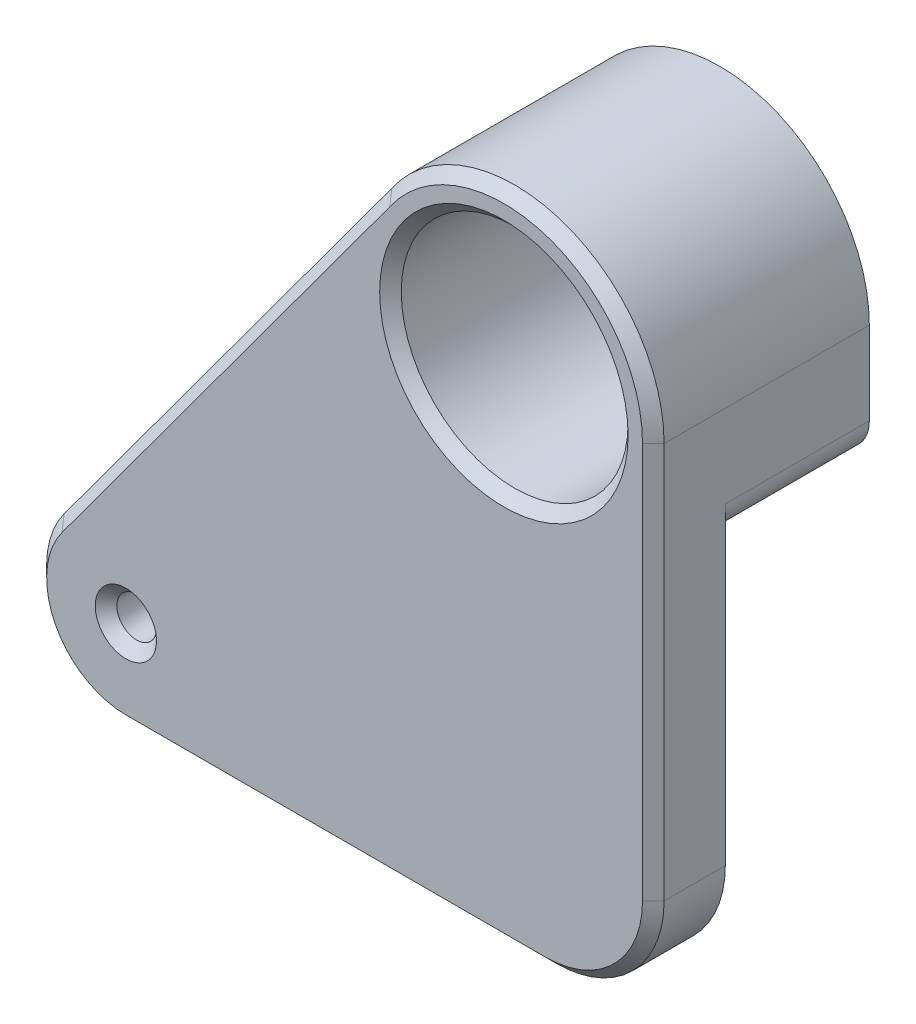
ISO-10303-21;
HEADER;
FILE_DESCRIPTION(('STEP AP214'),'2;1');
FILE_NAME('part.step','',(''),(''),'','','');
FILE_SCHEMA(('AUTOMOTIVE_DESIGN { 1 0 10303 214 1 1 1 1 }'));
ENDSEC;
DATA;
#1=APPLICATION_CONTEXT('core data for automotive mechanical design processes');
#2=APPLICATION_PROTOCOL_DEFINITION('international standard','automotive_design',2000,#1);
#3=PRODUCT_CONTEXT('',#1,'mechanical');
#4=PRODUCT('Part','Part','',(#3));
#5=PRODUCT_RELATED_PRODUCT_CATEGORY('part','',(#4));
#6=PRODUCT_DEFINITION_FORMATION('','',#4);
#7=PRODUCT_DEFINITION_CONTEXT('part definition',#1,'design');
#8=PRODUCT_DEFINITION('design','',#6,#7);
#9=PRODUCT_DEFINITION_SHAPE('','',#8);
#10=(LENGTH_UNIT() NAMED_UNIT(*) SI_UNIT(.MILLI.,.METRE.));
#11=(NAMED_UNIT(*) PLANE_ANGLE_UNIT() SI_UNIT($,.RADIAN.));
#12=(NAMED_UNIT(*) SI_UNIT($,.STERADIAN.) SOLID_ANGLE_UNIT());
#13=UNCERTAINTY_MEASURE_WITH_UNIT(LENGTH_MEASURE(1.E-05),#10,'distance_accuracy_value','');
#14=(GEOMETRIC_REPRESENTATION_CONTEXT(3) GLOBAL_UNCERTAINTY_ASSIGNED_CONTEXT((#13)) GLOBAL_UNIT_ASSIGNED_CONTEXT((#10,
#11,#12)) REPRESENTATION_CONTEXT('',''));
#15=CARTESIAN_POINT('',(0.,0.,0.));
#16=DIRECTION('',(0.,0.,1.));
#17=DIRECTION('',(1.,0.,0.));
#18=AXIS2_PLACEMENT_3D('',#15,#16,#17);
#19=CARTESIAN_POINT('',(0.,0.,0.));
#20=DIRECTION('',(0.,0.,1.));
#21=DIRECTION('',(1.,0.,0.));
#22=AXIS2_PLACEMENT_3D('',#19,#20,#21);
#23=PLANE('',#22);
#24=CARTESIAN_POINT('',(150.,-74.,0.));
#25=DIRECTION('',(0.,0.,1.));
#26=DIRECTION('',(1.,0.,0.));
#27=AXIS2_PLACEMENT_3D('',#24,#25,#26);
#28=CIRCLE('',#27,5.50000000000002);
#29=CARTESIAN_POINT('',(155.5,-74.,0.));
#30=VERTEX_POINT('',#29);
#31=EDGE_CURVE('E180',#30,#30,#28,.T.);
#32=ORIENTED_EDGE('',*,*,#31,.T.);
#33=EDGE_LOOP('',(#32));
#34=FACE_BOUND('',#33,.T.);
#35=DIRECTION('',(-1.,0.,0.));
#36=VECTOR('',#35,1.);
#37=CARTESIAN_POINT('',(296.50000002308,8.,0.));
#38=LINE('',#37,#36);
#39=CARTESIAN_POINT('',(286.50000002308,8.,0.));
#40=VERTEX_POINT('',#39);
#41=CARTESIAN_POINT('',(199.016746883648,8.,0.));
#42=VERTEX_POINT('',#41);
#43=EDGE_CURVE('E158',#40,#42,#38,.T.);
#44=ORIENTED_EDGE('',*,*,#43,.F.);
#45=CARTESIAN_POINT('',(286.50000002308,18.,0.));
#46=DIRECTION('',(0.,0.,1.));
#47=DIRECTION('',(1.,0.,0.));
#48=AXIS2_PLACEMENT_3D('',#45,#46,#47);
#49=CIRCLE('',#48,10.);
#50=CARTESIAN_POINT('',(296.50000002308,18.,0.));
#51=VERTEX_POINT('',#50);
#52=EDGE_CURVE('E45',#40,#51,#49,.T.);
#53=ORIENTED_EDGE('',*,*,#52,.T.);
#54=DIRECTION('',(0.,-1.,0.));
#55=VECTOR('',#54,1.);
#56=CARTESIAN_POINT('',(296.50000002308,0.,0.));
#57=LINE('',#56,#55);
#58=CARTESIAN_POINT('',(296.50000002308,-69.,0.));
#59=VERTEX_POINT('',#58);
#60=EDGE_CURVE('E170',#51,#59,#57,.T.);
#61=ORIENTED_EDGE('',*,*,#60,.T.);
#62=CARTESIAN_POINT('',(266.50000002308,-69.,0.));
#63=DIRECTION('',(0.,0.,1.));
#64=DIRECTION('',(1.,0.,0.));
#65=AXIS2_PLACEMENT_3D('',#62,#63,#64);
#66=CIRCLE('',#65,30.);
#67=CARTESIAN_POINT('',(266.50000002308,-99.,0.));
#68=VERTEX_POINT('',#67);
#69=EDGE_CURVE('E166',#59,#68,#66,.F.);
#70=ORIENTED_EDGE('',*,*,#69,.T.);
#71=DIRECTION('',(1.,0.,0.));
#72=VECTOR('',#71,1.);
#73=CARTESIAN_POINT('',(0.,-99.,0.));
#74=LINE('',#73,#72);
#75=CARTESIAN_POINT('',(150.,-99.,0.));
#76=VERTEX_POINT('',#75);
#77=EDGE_CURVE('E177',#76,#68,#74,.T.);
#78=ORIENTED_EDGE('',*,*,#77,.F.);
#79=CARTESIAN_POINT('',(150.,-74.,0.));
#80=DIRECTION('',(0.,0.,1.));
#81=DIRECTION('',(1.,0.,0.));
#82=AXIS2_PLACEMENT_3D('',#79,#80,#81);
#83=CIRCLE('',#82,25.);
#84=CARTESIAN_POINT('',(129.857356647174,-59.1920994479014,0.));
#85=VERTEX_POINT('',#84);
#86=EDGE_CURVE('E174',#85,#76,#83,.T.);
#87=ORIENTED_EDGE('',*,*,#86,.F.);
#88=DIRECTION('',(-0.592316022083946,-0.805705734113052,0.));
#89=VECTOR('',#88,1.);
#90=CARTESIAN_POINT('',(112.546814884176,-82.7389937391953,0.));
#91=LINE('',#90,#89);
#92=CARTESIAN_POINT('',(190.959689542517,23.9231602208395,0.));
#93=VERTEX_POINT('',#92);
#94=EDGE_CURVE('E51',#93,#85,#91,.T.);
#95=ORIENTED_EDGE('',*,*,#94,.F.);
#96=CARTESIAN_POINT('',(199.016746883648,18.,0.));
#97=DIRECTION('',(0.,0.,1.));
#98=DIRECTION('',(1.,0.,0.));
#99=AXIS2_PLACEMENT_3D('',#96,#97,#98);
#100=CIRCLE('',#99,10.);
#101=EDGE_CURVE('E11',#93,#42,#100,.T.);
#102=ORIENTED_EDGE('',*,*,#101,.T.);
#103=EDGE_LOOP('',(#44,#53,#61,#70,#78,#87,#95,#102));
#104=FACE_BOUND('',#103,.T.);
#105=ADVANCED_FACE('F37',(#34,#104),#23,.F.);
#106=CARTESIAN_POINT('',(266.50000002308,-69.,20.));
#107=DIRECTION('',(0.,0.,-1.));
#108=DIRECTION('',(-1.,0.,0.));
#109=AXIS2_PLACEMENT_3D('',#106,#107,#108);
#110=CYLINDRICAL_SURFACE('',#109,30.);
#111=DIRECTION('',(0.,0.,-1.));
#112=VECTOR('',#111,1.);
#113=CARTESIAN_POINT('',(296.50000002308,-69.,20.));
#114=LINE('',#113,#112);
#115=CARTESIAN_POINT('',(296.50000002308,-69.,17.));
#116=VERTEX_POINT('',#115);
#117=EDGE_CURVE('E143',#116,#59,#114,.T.);
#118=ORIENTED_EDGE('',*,*,#117,.F.);
#119=CARTESIAN_POINT('',(266.50000002308,-69.,17.));
#120=DIRECTION('',(0.,0.,1.));
#121=DIRECTION('',(1.,0.,0.));
#122=AXIS2_PLACEMENT_3D('',#119,#120,#121);
#123=CIRCLE('',#122,30.);
#124=CARTESIAN_POINT('',(266.50000002308,-99.,17.));
#125=VERTEX_POINT('',#124);
#126=EDGE_CURVE('E226',#116,#125,#123,.F.);
#127=ORIENTED_EDGE('',*,*,#126,.T.);
#128=DIRECTION('',(0.,0.,-1.));
#129=VECTOR('',#128,1.);
#130=CARTESIAN_POINT('',(266.50000002308,-99.,20.));
#131=LINE('',#130,#129);
#132=EDGE_CURVE('E183',#125,#68,#131,.T.);
#133=ORIENTED_EDGE('',*,*,#132,.T.);
#134=ORIENTED_EDGE('',*,*,#69,.F.);
#135=EDGE_LOOP('',(#118,#127,#133,#134));
#136=FACE_BOUND('',#135,.T.);
#137=ADVANCED_FACE('F278',(#136),#110,.T.);
#138=CARTESIAN_POINT('',(296.50000002308,0.,20.));
#139=DIRECTION('',(1.,0.,0.));
#140=DIRECTION('',(0.,0.,-1.));
#141=AXIS2_PLACEMENT_3D('',#138,#139,#140);
#142=PLANE('',#141);
#143=ORIENTED_EDGE('',*,*,#60,.F.);
#144=DIRECTION('',(0.,0.,1.));
#145=VECTOR('',#144,1.);
#146=CARTESIAN_POINT('',(296.50000002308,18.,-40.));
#147=LINE('',#146,#145);
#148=CARTESIAN_POINT('',(296.50000002308,18.,-40.));
#149=VERTEX_POINT('',#148);
#150=EDGE_CURVE('E150',#51,#149,#147,.F.);
#151=ORIENTED_EDGE('',*,*,#150,.T.);
#152=DIRECTION('',(0.,-1.,0.));
#153=VECTOR('',#152,1.);
#154=CARTESIAN_POINT('',(296.50000002308,40.9999999724445,-40.));
#155=LINE('',#154,#153);
#156=CARTESIAN_POINT('',(296.50000002308,40.9999999724445,-40.));
#157=VERTEX_POINT('',#156);
#158=EDGE_CURVE('E147',#157,#149,#155,.T.);
#159=ORIENTED_EDGE('',*,*,#158,.F.);
#160=DIRECTION('',(0.,0.,-1.));
#161=VECTOR('',#160,1.);
#162=CARTESIAN_POINT('',(296.50000002308,40.9999999724445,20.));
#163=LINE('',#162,#161);
#164=CARTESIAN_POINT('',(296.50000002308,40.9999999724445,17.));
#165=VERTEX_POINT('',#164);
#166=EDGE_CURVE('E133',#165,#157,#163,.T.);
#167=ORIENTED_EDGE('',*,*,#166,.F.);
#168=DIRECTION('',(0.,-1.,0.));
#169=VECTOR('',#168,1.);
#170=CARTESIAN_POINT('',(296.50000002308,0.,17.));
#171=LINE('',#170,#169);
#172=EDGE_CURVE('E224',#165,#116,#171,.T.);
#173=ORIENTED_EDGE('',*,*,#172,.T.);
#174=ORIENTED_EDGE('',*,*,#117,.T.);
#175=EDGE_LOOP('',(#143,#151,#159,#167,#173,#174));
#176=FACE_BOUND('',#175,.T.);
#177=ADVANCED_FACE('F148',(#176),#142,.T.);
#178=CARTESIAN_POINT('',(255.00000002308,40.9999999724445,20.));
#179=DIRECTION('',(0.,0.,-1.));
#180=DIRECTION('',(-1.,0.,0.));
#181=AXIS2_PLACEMENT_3D('',#178,#179,#180);
#182=CYLINDRICAL_SURFACE('',#181,41.5);
#183=DIRECTION('',(0.,0.,-1.));
#184=VECTOR('',#183,1.);
#185=CARTESIAN_POINT('',(220.868632913382,64.6071975872188,20.));
#186=LINE('',#185,#184);
#187=CARTESIAN_POINT('',(220.868632913382,64.6071975872188,17.));
#188=VERTEX_POINT('',#187);
#189=CARTESIAN_POINT('',(220.868632913382,64.6071975872188,-40.));
#190=VERTEX_POINT('',#189);
#191=EDGE_CURVE('E144',#188,#190,#186,.T.);
#192=ORIENTED_EDGE('',*,*,#191,.F.);
#193=CARTESIAN_POINT('',(255.00000002308,40.9999999724445,17.));
#194=DIRECTION('',(0.,0.,1.));
#195=DIRECTION('',(1.,0.,0.));
#196=AXIS2_PLACEMENT_3D('',#193,#194,#195);
#197=CIRCLE('',#196,41.5);
#198=EDGE_CURVE('E140',#188,#165,#197,.F.);
#199=ORIENTED_EDGE('',*,*,#198,.T.);
#200=ORIENTED_EDGE('',*,*,#166,.T.);
#201=CARTESIAN_POINT('',(255.00000002308,40.9999999724445,-40.));
#202=DIRECTION('',(0.,0.,-1.));
#203=DIRECTION('',(-1.,0.,0.));
#204=AXIS2_PLACEMENT_3D('',#201,#202,#203);
#205=CIRCLE('',#204,41.5);
#206=EDGE_CURVE('E138',#190,#157,#205,.T.);
#207=ORIENTED_EDGE('',*,*,#206,.F.);
#208=EDGE_LOOP('',(#192,#199,#200,#207));
#209=FACE_BOUND('',#208,.T.);
#210=ADVANCED_FACE('F136',(#209),#182,.T.);
#211=CARTESIAN_POINT('',(112.546814884176,-82.7389937391953,20.));
#212=DIRECTION('',(0.805705734113051,-0.592316022083946,0.));
#213=DIRECTION('',(0.592316022083946,0.805705734113051,0.));
#214=AXIS2_PLACEMENT_3D('',#211,#212,#213);
#215=PLANE('',#214);
#216=DIRECTION('',(0.592316022083946,0.805705734113051,0.));
#217=VECTOR('',#216,1.);
#218=CARTESIAN_POINT('',(220.868632913382,64.6071975872188,-40.));
#219=LINE('',#218,#217);
#220=CARTESIAN_POINT('',(190.959689542517,23.9231602208395,-40.));
#221=VERTEX_POINT('',#220);
#222=EDGE_CURVE('E156',#221,#190,#219,.T.);
#223=ORIENTED_EDGE('',*,*,#222,.F.);
#224=DIRECTION('',(0.,0.,1.));
#225=VECTOR('',#224,1.);
#226=CARTESIAN_POINT('',(190.959689542517,23.9231602208395,20.));
#227=LINE('',#226,#225);
#228=EDGE_CURVE('E378',#221,#93,#227,.T.);
#229=ORIENTED_EDGE('',*,*,#228,.T.);
#230=ORIENTED_EDGE('',*,*,#94,.T.);
#231=DIRECTION('',(0.,0.,-1.));
#232=VECTOR('',#231,1.);
#233=CARTESIAN_POINT('',(129.857356647174,-59.1920994479014,20.));
#234=LINE('',#233,#232);
#235=CARTESIAN_POINT('',(129.857356647174,-59.1920994479014,17.));
#236=VERTEX_POINT('',#235);
#237=EDGE_CURVE('E187',#236,#85,#234,.T.);
#238=ORIENTED_EDGE('',*,*,#237,.F.);
#239=DIRECTION('',(0.592316022083946,0.805705734113051,0.));
#240=VECTOR('',#239,1.);
#241=CARTESIAN_POINT('',(220.868632913382,64.6071975872188,17.));
#242=LINE('',#241,#240);
#243=EDGE_CURVE('E221',#236,#188,#242,.T.);
#244=ORIENTED_EDGE('',*,*,#243,.T.);
#245=ORIENTED_EDGE('',*,*,#191,.T.);
#246=EDGE_LOOP('',(#223,#229,#230,#238,#244,#245));
#247=FACE_BOUND('',#246,.T.);
#248=ADVANCED_FACE('F307',(#247),#215,.F.);
#249=CARTESIAN_POINT('',(150.,-74.,20.));
#250=DIRECTION('',(0.,0.,-1.));
#251=DIRECTION('',(-1.,0.,0.));
#252=AXIS2_PLACEMENT_3D('',#249,#250,#251);
#253=CYLINDRICAL_SURFACE('',#252,25.);
#254=DIRECTION('',(0.,0.,-1.));
#255=VECTOR('',#254,1.);
#256=CARTESIAN_POINT('',(150.,-99.,20.));
#257=LINE('',#256,#255);
#258=CARTESIAN_POINT('',(150.,-99.,17.));
#259=VERTEX_POINT('',#258);
#260=EDGE_CURVE('E185',#259,#76,#257,.T.);
#261=ORIENTED_EDGE('',*,*,#260,.F.);
#262=CARTESIAN_POINT('',(150.,-74.,17.));
#263=DIRECTION('',(0.,0.,1.));
#264=DIRECTION('',(1.,0.,0.));
#265=AXIS2_PLACEMENT_3D('',#262,#263,#264);
#266=CIRCLE('',#265,25.);
#267=EDGE_CURVE('E219',#259,#236,#266,.F.);
#268=ORIENTED_EDGE('',*,*,#267,.T.);
#269=ORIENTED_EDGE('',*,*,#237,.T.);
#270=ORIENTED_EDGE('',*,*,#86,.T.);
#271=EDGE_LOOP('',(#261,#268,#269,#270));
#272=FACE_BOUND('',#271,.T.);
#273=ADVANCED_FACE('F300',(#272),#253,.T.);
#274=CARTESIAN_POINT('',(255.00000002308,40.9999999724445,20.));
#275=DIRECTION('',(0.,0.,-1.));
#276=DIRECTION('',(-1.,0.,0.));
#277=AXIS2_PLACEMENT_3D('',#274,#275,#276);
#278=CYLINDRICAL_SURFACE('',#277,31.5);
#279=CARTESIAN_POINT('',(255.00000002308,40.9999999724445,17.));
#280=DIRECTION('',(0.,0.,1.));
#281=DIRECTION('',(1.,0.,0.));
#282=AXIS2_PLACEMENT_3D('',#279,#280,#281);
#283=CIRCLE('',#282,31.5);
#284=CARTESIAN_POINT('',(286.50000002308,40.9999999724445,17.));
#285=VERTEX_POINT('',#284);
#286=EDGE_CURVE('E213',#285,#285,#283,.T.);
#287=ORIENTED_EDGE('',*,*,#286,.T.);
#288=EDGE_LOOP('',(#287));
#289=FACE_BOUND('',#288,.T.);
#290=CARTESIAN_POINT('',(255.00000002308,40.9999999724445,-40.));
#291=DIRECTION('',(0.,0.,-1.));
#292=DIRECTION('',(-1.,0.,0.));
#293=AXIS2_PLACEMENT_3D('',#290,#291,#292);
#294=CIRCLE('',#293,31.5000000000001);
#295=CARTESIAN_POINT('',(223.50000002308,40.9999999724445,-40.));
#296=VERTEX_POINT('',#295);
#297=EDGE_CURVE('E161',#296,#296,#294,.T.);
#298=ORIENTED_EDGE('',*,*,#297,.T.);
#299=EDGE_LOOP('',(#298));
#300=FACE_BOUND('',#299,.T.);
#301=ADVANCED_FACE('F297',(#289,#300),#278,.F.);
#302=CARTESIAN_POINT('',(0.,-99.,20.));
#303=DIRECTION('',(0.,1.,0.));
#304=DIRECTION('',(-1.,0.,0.));
#305=AXIS2_PLACEMENT_3D('',#302,#303,#304);
#306=PLANE('',#305);
#307=ORIENTED_EDGE('',*,*,#132,.F.);
#308=DIRECTION('',(-1.,0.,0.));
#309=VECTOR('',#308,1.);
#310=CARTESIAN_POINT('',(150.,-99.,17.));
#311=LINE('',#310,#309);
#312=EDGE_CURVE('E216',#125,#259,#311,.T.);
#313=ORIENTED_EDGE('',*,*,#312,.T.);
#314=ORIENTED_EDGE('',*,*,#260,.T.);
#315=ORIENTED_EDGE('',*,*,#77,.T.);
#316=EDGE_LOOP('',(#307,#313,#314,#315));
#317=FACE_BOUND('',#316,.T.);
#318=ADVANCED_FACE('F295',(#317),#306,.F.);
#319=CARTESIAN_POINT('',(150.,-74.,20.));
#320=DIRECTION('',(0.,0.,-1.));
#321=DIRECTION('',(-1.,0.,0.));
#322=AXIS2_PLACEMENT_3D('',#319,#320,#321);
#323=CYLINDRICAL_SURFACE('',#322,5.50000000000002);
#324=CARTESIAN_POINT('',(150.,-74.,17.));
#325=DIRECTION('',(0.,0.,1.));
#326=DIRECTION('',(1.,0.,0.));
#327=AXIS2_PLACEMENT_3D('',#324,#325,#326);
#328=CIRCLE('',#327,5.50000000000002);
#329=CARTESIAN_POINT('',(155.5,-74.,17.));
#330=VERTEX_POINT('',#329);
#331=EDGE_CURVE('E191',#330,#330,#328,.T.);
#332=ORIENTED_EDGE('',*,*,#331,.T.);
#333=EDGE_LOOP('',(#332));
#334=FACE_BOUND('',#333,.T.);
#335=ORIENTED_EDGE('',*,*,#31,.F.);
#336=EDGE_LOOP('',(#335));
#337=FACE_BOUND('',#336,.T.);
#338=ADVANCED_FACE('F292',(#334,#337),#323,.F.);
#339=CARTESIAN_POINT('',(0.,0.,20.));
#340=DIRECTION('',(0.,0.,1.));
#341=DIRECTION('',(1.,0.,0.));
#342=AXIS2_PLACEMENT_3D('',#339,#340,#341);
#343=PLANE('',#342);
#344=CARTESIAN_POINT('',(150.,-74.,20.));
#345=DIRECTION('',(0.,0.,1.));
#346=DIRECTION('',(1.,0.,0.));
#347=AXIS2_PLACEMENT_3D('',#344,#345,#346);
#348=CIRCLE('',#347,8.50000000000004);
#349=CARTESIAN_POINT('',(158.5,-74.,20.));
#350=VERTEX_POINT('',#349);
#351=EDGE_CURVE('E210',#350,#350,#348,.F.);
#352=ORIENTED_EDGE('',*,*,#351,.T.);
#353=EDGE_LOOP('',(#352));
#354=FACE_BOUND('',#353,.T.);
#355=CARTESIAN_POINT('',(255.00000002308,40.9999999724445,20.));
#356=DIRECTION('',(0.,0.,1.));
#357=DIRECTION('',(1.,0.,0.));
#358=AXIS2_PLACEMENT_3D('',#355,#356,#357);
#359=CIRCLE('',#358,34.5);
#360=CARTESIAN_POINT('',(289.50000002308,40.9999999724445,20.));
#361=VERTEX_POINT('',#360);
#362=EDGE_CURVE('E207',#361,#361,#359,.F.);
#363=ORIENTED_EDGE('',*,*,#362,.T.);
#364=EDGE_LOOP('',(#363));
#365=FACE_BOUND('',#364,.T.);
#366=CARTESIAN_POINT('',(150.,-74.,20.));
#367=DIRECTION('',(0.,0.,1.));
#368=DIRECTION('',(1.,0.,0.));
#369=AXIS2_PLACEMENT_3D('',#366,#367,#368);
#370=CIRCLE('',#369,22.);
#371=CARTESIAN_POINT('',(132.274473849513,-60.9690475141532,20.));
#372=VERTEX_POINT('',#371);
#373=CARTESIAN_POINT('',(150.,-96.,20.));
#374=VERTEX_POINT('',#373);
#375=EDGE_CURVE('E202',#372,#374,#370,.T.);
#376=ORIENTED_EDGE('',*,*,#375,.T.);
#377=DIRECTION('',(1.,0.,0.));
#378=VECTOR('',#377,1.);
#379=CARTESIAN_POINT('',(266.50000002308,-96.,20.));
#380=LINE('',#379,#378);
#381=CARTESIAN_POINT('',(266.50000002308,-96.,20.));
#382=VERTEX_POINT('',#381);
#383=EDGE_CURVE('E204',#374,#382,#380,.T.);
#384=ORIENTED_EDGE('',*,*,#383,.T.);
#385=CARTESIAN_POINT('',(266.50000002308,-69.,20.));
#386=DIRECTION('',(0.,0.,1.));
#387=DIRECTION('',(1.,0.,0.));
#388=AXIS2_PLACEMENT_3D('',#385,#386,#387);
#389=CIRCLE('',#388,27.);
#390=CARTESIAN_POINT('',(293.50000002308,-69.,20.));
#391=VERTEX_POINT('',#390);
#392=EDGE_CURVE('E194',#382,#391,#389,.T.);
#393=ORIENTED_EDGE('',*,*,#392,.T.);
#394=DIRECTION('',(0.,1.,0.));
#395=VECTOR('',#394,1.);
#396=CARTESIAN_POINT('',(293.50000002308,0.,20.));
#397=LINE('',#396,#395);
#398=CARTESIAN_POINT('',(293.50000002308,40.9999999724445,20.));
#399=VERTEX_POINT('',#398);
#400=EDGE_CURVE('E196',#391,#399,#397,.T.);
#401=ORIENTED_EDGE('',*,*,#400,.T.);
#402=CARTESIAN_POINT('',(255.00000002308,40.9999999724445,20.));
#403=DIRECTION('',(0.,0.,1.));
#404=DIRECTION('',(1.,0.,0.));
#405=AXIS2_PLACEMENT_3D('',#402,#403,#404);
#406=CIRCLE('',#405,38.5);
#407=CARTESIAN_POINT('',(223.311843289943,62.8657431076803,20.));
#408=VERTEX_POINT('',#407);
#409=EDGE_CURVE('E198',#399,#408,#406,.T.);
#410=ORIENTED_EDGE('',*,*,#409,.T.);
#411=DIRECTION('',(-0.592316022083946,-0.805705734113051,0.));
#412=VECTOR('',#411,1.);
#413=CARTESIAN_POINT('',(132.274473849513,-60.9690475141532,20.));
#414=LINE('',#413,#412);
#415=EDGE_CURVE('E200',#408,#372,#414,.T.);
#416=ORIENTED_EDGE('',*,*,#415,.T.);
#417=EDGE_LOOP('',(#376,#384,#393,#401,#410,#416));
#418=FACE_BOUND('',#417,.T.);
#419=ADVANCED_FACE('F290',(#354,#365,#418),#343,.T.);
#420=CARTESIAN_POINT('',(255.00000002308,40.9999999724445,-40.));
#421=DIRECTION('',(0.,0.,-1.));
#422=DIRECTION('',(-1.,0.,0.));
#423=AXIS2_PLACEMENT_3D('',#420,#421,#422);
#424=PLANE('',#423);
#425=ORIENTED_EDGE('',*,*,#158,.T.);
#426=CARTESIAN_POINT('',(286.50000002308,18.,-40.));
#427=DIRECTION('',(0.,0.,-1.));
#428=DIRECTION('',(-1.,0.,0.));
#429=AXIS2_PLACEMENT_3D('',#426,#427,#428);
#430=CIRCLE('',#429,10.);
#431=CARTESIAN_POINT('',(286.50000002308,8.,-40.));
#432=VERTEX_POINT('',#431);
#433=EDGE_CURVE('E383',#149,#432,#430,.T.);
#434=ORIENTED_EDGE('',*,*,#433,.T.);
#435=DIRECTION('',(-1.,0.,0.));
#436=VECTOR('',#435,1.);
#437=CARTESIAN_POINT('',(296.50000002308,8.,-40.));
#438=LINE('',#437,#436);
#439=CARTESIAN_POINT('',(199.016746883648,8.,-40.));
#440=VERTEX_POINT('',#439);
#441=EDGE_CURVE('E152',#432,#440,#438,.T.);
#442=ORIENTED_EDGE('',*,*,#441,.T.);
#443=CARTESIAN_POINT('',(199.016746883648,18.,-40.));
#444=DIRECTION('',(0.,0.,-1.));
#445=DIRECTION('',(-1.,0.,0.));
#446=AXIS2_PLACEMENT_3D('',#443,#444,#445);
#447=CIRCLE('',#446,10.);
#448=EDGE_CURVE('E59',#440,#221,#447,.T.);
#449=ORIENTED_EDGE('',*,*,#448,.T.);
#450=ORIENTED_EDGE('',*,*,#222,.T.);
#451=ORIENTED_EDGE('',*,*,#206,.T.);
#452=EDGE_LOOP('',(#425,#434,#442,#449,#450,#451));
#453=FACE_BOUND('',#452,.T.);
#454=ORIENTED_EDGE('',*,*,#297,.F.);
#455=EDGE_LOOP('',(#454));
#456=FACE_BOUND('',#455,.T.);
#457=ADVANCED_FACE('F154',(#453,#456),#424,.T.);
#458=CARTESIAN_POINT('',(296.50000002308,8.,-40.));
#459=DIRECTION('',(0.,1.,0.));
#460=DIRECTION('',(0.,0.,1.));
#461=AXIS2_PLACEMENT_3D('',#458,#459,#460);
#462=PLANE('',#461);
#463=ORIENTED_EDGE('',*,*,#441,.F.);
#464=DIRECTION('',(0.,0.,1.));
#465=VECTOR('',#464,1.);
#466=CARTESIAN_POINT('',(286.50000002308,8.,0.));
#467=LINE('',#466,#465);
#468=EDGE_CURVE('E384',#432,#40,#467,.T.);
#469=ORIENTED_EDGE('',*,*,#468,.T.);
#470=ORIENTED_EDGE('',*,*,#43,.T.);
#471=DIRECTION('',(0.,0.,1.));
#472=VECTOR('',#471,1.);
#473=CARTESIAN_POINT('',(199.016746883648,8.,-40.));
#474=LINE('',#473,#472);
#475=EDGE_CURVE('E228',#42,#440,#474,.F.);
#476=ORIENTED_EDGE('',*,*,#475,.T.);
#477=EDGE_LOOP('',(#463,#469,#470,#476));
#478=FACE_BOUND('',#477,.T.);
#479=ADVANCED_FACE('F321',(#478),#462,.F.);
#480=CARTESIAN_POINT('',(150.,-74.,17.));
#481=DIRECTION('',(0.,0.,1.));
#482=DIRECTION('',(1.,0.,0.));
#483=AXIS2_PLACEMENT_3D('',#480,#481,#482);
#484=CONICAL_SURFACE('',#483,5.50000000000002,0.785398163397454);
#485=ORIENTED_EDGE('',*,*,#351,.F.);
#486=EDGE_LOOP('',(#485));
#487=FACE_BOUND('',#486,.T.);
#488=ORIENTED_EDGE('',*,*,#331,.F.);
#489=EDGE_LOOP('',(#488));
#490=FACE_BOUND('',#489,.T.);
#491=ADVANCED_FACE('F316',(#487,#490),#484,.F.);
#492=CARTESIAN_POINT('',(255.00000002308,40.9999999724445,17.));
#493=DIRECTION('',(0.,0.,1.));
#494=DIRECTION('',(1.,0.,0.));
#495=AXIS2_PLACEMENT_3D('',#492,#493,#494);
#496=CONICAL_SURFACE('',#495,31.5,0.785398163397445);
#497=CARTESIAN_POINT('',(289.50000002308,40.9999999724445,20.));
#498=CARTESIAN_POINT('',(289.46875002308,40.9999999724445,19.96875));
#499=CARTESIAN_POINT('',(289.43750002308,40.9999999724445,19.9375));
#500=CARTESIAN_POINT('',(289.37500002308,40.9999999724445,19.875));
#501=CARTESIAN_POINT('',(289.34375002308,40.9999999724445,19.84375));
#502=CARTESIAN_POINT('',(289.28125002308,40.9999999724445,19.78125));
#503=CARTESIAN_POINT('',(289.25000002308,40.9999999724445,19.75));
#504=CARTESIAN_POINT('',(289.18750002308,40.9999999724445,19.6875));
#505=CARTESIAN_POINT('',(289.15625002308,40.9999999724445,19.65625));
#506=CARTESIAN_POINT('',(289.09375002308,40.9999999724445,19.59375));
#507=CARTESIAN_POINT('',(289.06250002308,40.9999999724445,19.5625));
#508=CARTESIAN_POINT('',(289.00000002308,40.9999999724445,19.5));
#509=CARTESIAN_POINT('',(288.96875002308,40.9999999724445,19.46875));
#510=CARTESIAN_POINT('',(288.90625002308,40.9999999724445,19.40625));
#511=CARTESIAN_POINT('',(288.87500002308,40.9999999724445,19.375));
#512=CARTESIAN_POINT('',(288.81250002308,40.9999999724445,19.3125));
#513=CARTESIAN_POINT('',(288.78125002308,40.9999999724445,19.28125));
#514=CARTESIAN_POINT('',(288.71875002308,40.9999999724445,19.21875));
#515=CARTESIAN_POINT('',(288.68750002308,40.9999999724445,19.1875));
#516=CARTESIAN_POINT('',(288.62500002308,40.9999999724445,19.125));
#517=CARTESIAN_POINT('',(288.59375002308,40.9999999724445,19.09375));
#518=CARTESIAN_POINT('',(288.53125002308,40.9999999724445,19.03125));
#519=CARTESIAN_POINT('',(288.50000002308,40.9999999724445,19.));
#520=CARTESIAN_POINT('',(288.43750002308,40.9999999724445,18.9375));
#521=CARTESIAN_POINT('',(288.40625002308,40.9999999724445,18.90625));
#522=CARTESIAN_POINT('',(288.34375002308,40.9999999724445,18.84375));
#523=CARTESIAN_POINT('',(288.31250002308,40.9999999724445,18.8125));
#524=CARTESIAN_POINT('',(288.25000002308,40.9999999724445,18.75));
#525=CARTESIAN_POINT('',(288.21875002308,40.9999999724445,18.71875));
#526=CARTESIAN_POINT('',(288.15625002308,40.9999999724445,18.65625));
#527=CARTESIAN_POINT('',(288.12500002308,40.9999999724445,18.625));
#528=CARTESIAN_POINT('',(288.06250002308,40.9999999724445,18.5625));
#529=CARTESIAN_POINT('',(288.03125002308,40.9999999724445,18.53125));
#530=CARTESIAN_POINT('',(287.96875002308,40.9999999724445,18.46875));
#531=CARTESIAN_POINT('',(287.93750002308,40.9999999724445,18.4375));
#532=CARTESIAN_POINT('',(287.87500002308,40.9999999724445,18.375));
#533=CARTESIAN_POINT('',(287.84375002308,40.9999999724445,18.34375));
#534=CARTESIAN_POINT('',(287.78125002308,40.9999999724445,18.28125));
#535=CARTESIAN_POINT('',(287.75000002308,40.9999999724445,18.25));
#536=CARTESIAN_POINT('',(287.68750002308,40.9999999724445,18.1875));
#537=CARTESIAN_POINT('',(287.65625002308,40.9999999724445,18.15625));
#538=CARTESIAN_POINT('',(287.59375002308,40.9999999724445,18.09375));
#539=CARTESIAN_POINT('',(287.56250002308,40.9999999724445,18.0625));
#540=CARTESIAN_POINT('',(287.50000002308,40.9999999724445,18.));
#541=CARTESIAN_POINT('',(287.46875002308,40.9999999724445,17.96875));
#542=CARTESIAN_POINT('',(287.40625002308,40.9999999724445,17.90625));
#543=CARTESIAN_POINT('',(287.37500002308,40.9999999724445,17.875));
#544=CARTESIAN_POINT('',(287.31250002308,40.9999999724445,17.8125));
#545=CARTESIAN_POINT('',(287.28125002308,40.9999999724445,17.78125));
#546=CARTESIAN_POINT('',(287.21875002308,40.9999999724445,17.71875));
#547=CARTESIAN_POINT('',(287.18750002308,40.9999999724445,17.6875));
#548=CARTESIAN_POINT('',(287.12500002308,40.9999999724445,17.625));
#549=CARTESIAN_POINT('',(287.09375002308,40.9999999724445,17.59375));
#550=CARTESIAN_POINT('',(287.03125002308,40.9999999724445,17.53125));
#551=CARTESIAN_POINT('',(287.00000002308,40.9999999724445,17.5));
#552=CARTESIAN_POINT('',(286.93750002308,40.9999999724445,17.4375));
#553=CARTESIAN_POINT('',(286.90625002308,40.9999999724445,17.40625));
#554=CARTESIAN_POINT('',(286.84375002308,40.9999999724445,17.34375));
#555=CARTESIAN_POINT('',(286.81250002308,40.9999999724445,17.3125));
#556=CARTESIAN_POINT('',(286.75000002308,40.9999999724445,17.25));
#557=CARTESIAN_POINT('',(286.71875002308,40.9999999724445,17.21875));
#558=CARTESIAN_POINT('',(286.65625002308,40.9999999724445,17.15625));
#559=CARTESIAN_POINT('',(286.62500002308,40.9999999724445,17.125));
#560=CARTESIAN_POINT('',(286.56250002308,40.9999999724445,17.0625));
#561=CARTESIAN_POINT('',(286.53125002308,40.9999999724445,17.03125));
#562=CARTESIAN_POINT('',(286.50000002308,40.9999999724445,17.));
#563=B_SPLINE_CURVE_WITH_KNOTS('',3,(#497,#498,#499,#500,#501,#502,#503,#504,#505,#506,#507,
#508,#509,#510,#511,#512,#513,#514,#515,#516,#517,#518,#519,#520,#521,#522,#523,#524,#525,#526,
#527,#528,#529,#530,#531,#532,#533,#534,#535,#536,#537,#538,#539,#540,#541,#542,#543,#544,#545,
#546,#547,#548,#549,#550,#551,#552,#553,#554,#555,#556,#557,#558,#559,#560,#561,#562),
.UNSPECIFIED.,.F.,.F.,(4,2,2,2,2,2,2,2,2,2,2,2,2,2,2,2,2,2,2,2,2,2,2,2,2,2,2,2,2,2,2,2,4),(0.,
0.13258252147248,0.26516504294496,0.397747564417441,0.530330085889918,0.662912607362399,
0.795495128834879,0.92807765030732,1.0606601717798,1.19324269325228,1.32582521472476,
1.45840773619724,1.59099025766972,1.7235727791422,1.85615530061468,1.98873782208716,
2.12132034355963,2.25390286503208,2.38648538650456,2.51906790797704,2.65165042944951,
2.78423295092199,2.91681547239447,3.04939799386695,3.18198051533943,3.31456303681191,
3.44714555828439,3.57972807975687,3.71231060122935,3.84489312270179,3.97747564417427,
4.11005816564675,4.24264068711923),.UNSPECIFIED.);
#564=EDGE_CURVE('BSEAM263',#361,#285,#563,.T.);
#565=ORIENTED_EDGE('',*,*,#362,.F.);
#566=ORIENTED_EDGE('',*,*,#286,.F.);
#567=ORIENTED_EDGE('',*,*,#564,.T.);
#568=ORIENTED_EDGE('',*,*,#564,.F.);
#569=EDGE_LOOP('',(#565,#567,#566,#568));
#570=FACE_BOUND('',#569,.T.);
#571=ADVANCED_FACE('F263',(#570),#496,.F.);
#572=CARTESIAN_POINT('',(255.00000002308,40.9999999724445,20.));
#573=DIRECTION('',(0.,0.,-1.));
#574=DIRECTION('',(-1.,0.,0.));
#575=AXIS2_PLACEMENT_3D('',#572,#573,#574);
#576=CONICAL_SURFACE('',#575,38.5,0.785398163397451);
#577=DIRECTION('',(-0.707106781186549,0.,0.707106781186546));
#578=VECTOR('',#577,1.);
#579=CARTESIAN_POINT('',(296.50000002308,40.9999999724445,17.));
#580=LINE('',#579,#578);
#581=EDGE_CURVE('E239',#165,#399,#580,.T.);
#582=ORIENTED_EDGE('',*,*,#581,.F.);
#583=ORIENTED_EDGE('',*,*,#198,.F.);
#584=CARTESIAN_POINT('',(220.868632913382,64.6071975872188,17.));
#585=CARTESIAN_POINT('',(221.275753878756,64.3168436066583,17.5000010110412));
#586=CARTESIAN_POINT('',(221.682915226084,64.0265454098014,18.0000015164729));
#587=CARTESIAN_POINT('',(222.497318684937,63.4460605832886,19.0000015164729));
#588=CARTESIAN_POINT('',(222.904560796463,63.1558739536327,19.5000010110412));
#589=CARTESIAN_POINT('',(223.311843289943,62.8657431076805,20.));
#590=B_SPLINE_CURVE_WITH_KNOTS('',3,(#584,#585,#586,#587,#588,#589),.UNSPECIFIED.,.F.,.F.,(4,2,
4),(0.,2.12143470358938,4.24286940868786),.UNSPECIFIED.);
#591=EDGE_CURVE('E242',#408,#188,#590,.F.);
#592=ORIENTED_EDGE('',*,*,#591,.F.);
#593=ORIENTED_EDGE('',*,*,#409,.F.);
#594=EDGE_LOOP('',(#582,#583,#592,#593));
#595=FACE_BOUND('',#594,.T.);
#596=ADVANCED_FACE('F257',(#595),#576,.T.);
#597=CARTESIAN_POINT('',(114.963932086516,-84.5159418054472,20.));
#598=DIRECTION('',(-0.569719988232221,0.418830675820996,0.707106781186551));
#599=DIRECTION('',(0.592316022083946,0.805705734113051,0.));
#600=AXIS2_PLACEMENT_3D('',#597,#598,#599);
#601=PLANE('',#600);
#602=ORIENTED_EDGE('',*,*,#591,.T.);
#603=ORIENTED_EDGE('',*,*,#243,.F.);
#604=DIRECTION('',(-0.569719988232224,0.418830675820996,-0.707106781186549));
#605=VECTOR('',#604,1.);
#606=CARTESIAN_POINT('',(132.274473849513,-60.9690475141532,20.));
#607=LINE('',#606,#605);
#608=EDGE_CURVE('E236',#372,#236,#607,.T.);
#609=ORIENTED_EDGE('',*,*,#608,.F.);
#610=ORIENTED_EDGE('',*,*,#415,.F.);
#611=EDGE_LOOP('',(#602,#603,#609,#610));
#612=FACE_BOUND('',#611,.T.);
#613=ADVANCED_FACE('F253',(#612),#601,.T.);
#614=CARTESIAN_POINT('',(296.50000002308,0.,17.));
#615=DIRECTION('',(-0.707106781186546,0.,-0.707106781186549));
#616=DIRECTION('',(0.,-1.,0.));
#617=AXIS2_PLACEMENT_3D('',#614,#615,#616);
#618=PLANE('',#617);
#619=ORIENTED_EDGE('',*,*,#581,.T.);
#620=ORIENTED_EDGE('',*,*,#400,.F.);
#621=DIRECTION('',(-0.707106781186549,0.,0.707106781186546));
#622=VECTOR('',#621,1.);
#623=CARTESIAN_POINT('',(296.50000002308,-69.,17.));
#624=LINE('',#623,#622);
#625=EDGE_CURVE('E233',#116,#391,#624,.T.);
#626=ORIENTED_EDGE('',*,*,#625,.F.);
#627=ORIENTED_EDGE('',*,*,#172,.F.);
#628=EDGE_LOOP('',(#619,#620,#626,#627));
#629=FACE_BOUND('',#628,.T.);
#630=ADVANCED_FACE('F343',(#629),#618,.F.);
#631=CARTESIAN_POINT('',(150.,-74.,20.));
#632=DIRECTION('',(0.,0.,-1.));
#633=DIRECTION('',(-1.,0.,0.));
#634=AXIS2_PLACEMENT_3D('',#631,#632,#633);
#635=CONICAL_SURFACE('',#634,22.,0.785398163397451);
#636=ORIENTED_EDGE('',*,*,#608,.T.);
#637=ORIENTED_EDGE('',*,*,#267,.F.);
#638=DIRECTION('',(0.,-0.707106781186549,-0.707106781186546));
#639=VECTOR('',#638,1.);
#640=CARTESIAN_POINT('',(150.,-96.,20.));
#641=LINE('',#640,#639);
#642=EDGE_CURVE('E231',#374,#259,#641,.T.);
#643=ORIENTED_EDGE('',*,*,#642,.F.);
#644=ORIENTED_EDGE('',*,*,#375,.F.);
#645=EDGE_LOOP('',(#636,#637,#643,#644));
#646=FACE_BOUND('',#645,.T.);
#647=ADVANCED_FACE('F337',(#646),#635,.T.);
#648=CARTESIAN_POINT('',(266.50000002308,-69.,17.));
#649=DIRECTION('',(0.,0.,-1.));
#650=DIRECTION('',(-1.,0.,0.));
#651=AXIS2_PLACEMENT_3D('',#648,#649,#650);
#652=CONICAL_SURFACE('',#651,30.,0.785398163397452);
#653=ORIENTED_EDGE('',*,*,#625,.T.);
#654=ORIENTED_EDGE('',*,*,#392,.F.);
#655=DIRECTION('',(0.,0.707106781186551,0.707106781186544));
#656=VECTOR('',#655,1.);
#657=CARTESIAN_POINT('',(266.50000002308,-99.,17.));
#658=LINE('',#657,#656);
#659=EDGE_CURVE('E229',#125,#382,#658,.T.);
#660=ORIENTED_EDGE('',*,*,#659,.F.);
#661=ORIENTED_EDGE('',*,*,#126,.F.);
#662=EDGE_LOOP('',(#653,#654,#660,#661));
#663=FACE_BOUND('',#662,.T.);
#664=ADVANCED_FACE('F274',(#663),#652,.T.);
#665=CARTESIAN_POINT('',(0.,-96.,20.));
#666=DIRECTION('',(0.,-0.707106781186546,0.707106781186549));
#667=DIRECTION('',(-1.,0.,0.));
#668=AXIS2_PLACEMENT_3D('',#665,#666,#667);
#669=PLANE('',#668);
#670=ORIENTED_EDGE('',*,*,#642,.T.);
#671=ORIENTED_EDGE('',*,*,#312,.F.);
#672=ORIENTED_EDGE('',*,*,#659,.T.);
#673=ORIENTED_EDGE('',*,*,#383,.F.);
#674=EDGE_LOOP('',(#670,#671,#672,#673));
#675=FACE_BOUND('',#674,.T.);
#676=ADVANCED_FACE('F267',(#675),#669,.T.);
#677=CARTESIAN_POINT('',(286.50000002308,18.,-40.));
#678=DIRECTION('',(0.,0.,-1.));
#679=DIRECTION('',(-1.,0.,0.));
#680=AXIS2_PLACEMENT_3D('',#677,#678,#679);
#681=CYLINDRICAL_SURFACE('',#680,10.);
#682=ORIENTED_EDGE('',*,*,#433,.F.);
#683=ORIENTED_EDGE('',*,*,#150,.F.);
#684=ORIENTED_EDGE('',*,*,#52,.F.);
#685=ORIENTED_EDGE('',*,*,#468,.F.);
#686=EDGE_LOOP('',(#682,#683,#684,#685));
#687=FACE_BOUND('',#686,.T.);
#688=ADVANCED_FACE('F265',(#687),#681,.T.);
#689=CARTESIAN_POINT('',(199.016746883648,18.,20.));
#690=DIRECTION('',(0.,0.,1.));
#691=DIRECTION('',(1.,0.,0.));
#692=AXIS2_PLACEMENT_3D('',#689,#690,#691);
#693=CYLINDRICAL_SURFACE('',#692,10.);
#694=ORIENTED_EDGE('',*,*,#448,.F.);
#695=ORIENTED_EDGE('',*,*,#475,.F.);
#696=ORIENTED_EDGE('',*,*,#101,.F.);
#697=ORIENTED_EDGE('',*,*,#228,.F.);
#698=EDGE_LOOP('',(#694,#695,#696,#697));
#699=FACE_BOUND('',#698,.T.);
#700=ADVANCED_FACE('F39',(#699),#693,.T.);
#701=CLOSED_SHELL('',(#105,#137,#177,#210,#248,#273,#301,#318,#338,#419,#457,#479,#491,#571,
#596,#613,#630,#647,#664,#676,#688,#700));
#702=MANIFOLD_SOLID_BREP('B2',#701);
#703=ADVANCED_BREP_SHAPE_REPRESENTATION('',(#18,#702),#14);
#704=SHAPE_DEFINITION_REPRESENTATION(#9,#703);
ENDSEC;
END-ISO-10303-21;
